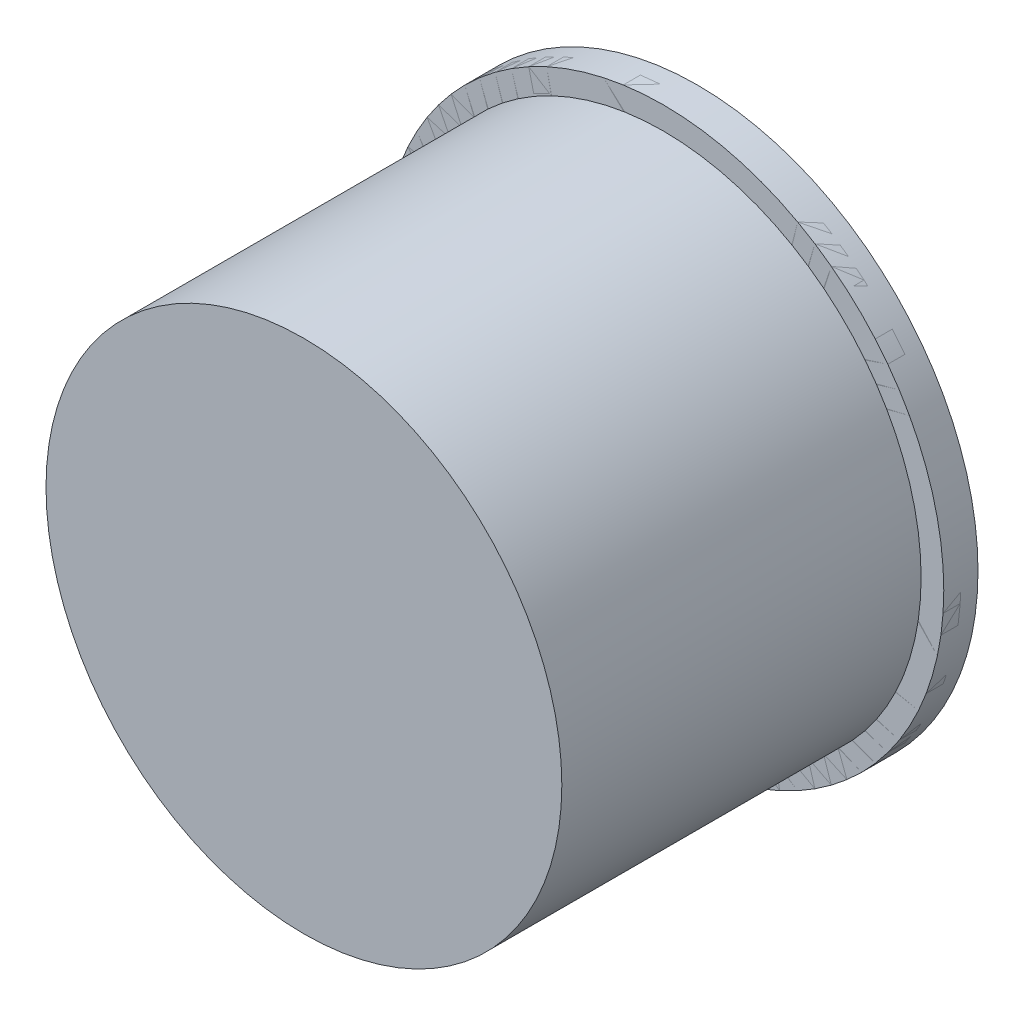
ISO-10303-21;
HEADER;
FILE_DESCRIPTION(('STEP AP214'),'2;1');
FILE_NAME('part.step','',(''),(''),'','','');
FILE_SCHEMA(('AUTOMOTIVE_DESIGN { 1 0 10303 214 1 1 1 1 }'));
ENDSEC;
DATA;
#1=APPLICATION_CONTEXT('core data for automotive mechanical design processes');
#2=APPLICATION_PROTOCOL_DEFINITION('international standard','automotive_design',2000,#1);
#3=PRODUCT_CONTEXT('',#1,'mechanical');
#4=PRODUCT('Part','Part','',(#3));
#5=PRODUCT_RELATED_PRODUCT_CATEGORY('part','',(#4));
#6=PRODUCT_DEFINITION_FORMATION('','',#4);
#7=PRODUCT_DEFINITION_CONTEXT('part definition',#1,'design');
#8=PRODUCT_DEFINITION('design','',#6,#7);
#9=PRODUCT_DEFINITION_SHAPE('','',#8);
#10=(LENGTH_UNIT() NAMED_UNIT(*) SI_UNIT(.MILLI.,.METRE.));
#11=(NAMED_UNIT(*) PLANE_ANGLE_UNIT() SI_UNIT($,.RADIAN.));
#12=(NAMED_UNIT(*) SI_UNIT($,.STERADIAN.) SOLID_ANGLE_UNIT());
#13=UNCERTAINTY_MEASURE_WITH_UNIT(LENGTH_MEASURE(1.E-05),#10,'distance_accuracy_value','');
#14=(GEOMETRIC_REPRESENTATION_CONTEXT(3) GLOBAL_UNCERTAINTY_ASSIGNED_CONTEXT((#13)) GLOBAL_UNIT_ASSIGNED_CONTEXT((#10,
#11,#12)) REPRESENTATION_CONTEXT('',''));
#15=CARTESIAN_POINT('',(0.,0.,0.));
#16=DIRECTION('',(0.,0.,1.));
#17=DIRECTION('',(1.,0.,0.));
#18=AXIS2_PLACEMENT_3D('',#15,#16,#17);
#19=CARTESIAN_POINT('',(0.,0.,-8.5));
#20=DIRECTION('',(0.,0.,1.));
#21=DIRECTION('',(1.,0.,0.));
#22=AXIS2_PLACEMENT_3D('',#19,#20,#21);
#23=CYLINDRICAL_SURFACE('',#22,16.4);
#24=CARTESIAN_POINT('',(0.,0.,-6.5));
#25=DIRECTION('',(0.,0.,-1.));
#26=DIRECTION('',(1.,0.,0.));
#27=AXIS2_PLACEMENT_3D('',#24,#25,#26);
#28=CIRCLE('',#27,16.4);
#29=CARTESIAN_POINT('',(16.4,0.,-6.5));
#30=VERTEX_POINT('',#29);
#31=EDGE_CURVE('P0_E63',#30,#30,#28,.T.);
#32=ORIENTED_EDGE('',*,*,#31,.T.);
#33=EDGE_LOOP('',(#32));
#34=FACE_BOUND('',#33,.T.);
#35=CARTESIAN_POINT('',(0.,0.,-7.5));
#36=DIRECTION('',(0.,0.,-1.));
#37=DIRECTION('',(-1.,0.,0.));
#38=AXIS2_PLACEMENT_3D('',#35,#36,#37);
#39=CIRCLE('',#38,16.4);
#40=CARTESIAN_POINT('',(-16.4,0.,-7.5));
#41=VERTEX_POINT('',#40);
#42=EDGE_CURVE('P0_E67',#41,#41,#39,.T.);
#43=ORIENTED_EDGE('',*,*,#42,.F.);
#44=EDGE_LOOP('',(#43));
#45=FACE_BOUND('',#44,.T.);
#46=ADVANCED_FACE('P0_F47',(#34,#45),#23,.T.);
#47=CARTESIAN_POINT('',(0.,0.,-6.5));
#48=DIRECTION('',(0.,0.,-1.));
#49=DIRECTION('',(0.,-1.,0.));
#50=AXIS2_PLACEMENT_3D('',#47,#48,#49);
#51=PLANE('',#50);
#52=CARTESIAN_POINT('',(0.,0.,-6.5));
#53=DIRECTION('',(0.,0.,-1.));
#54=DIRECTION('',(-1.,0.,0.));
#55=AXIS2_PLACEMENT_3D('',#52,#53,#54);
#56=CIRCLE('',#55,15.075);
#57=CARTESIAN_POINT('',(-15.075,0.,-6.5));
#58=VERTEX_POINT('',#57);
#59=EDGE_CURVE('P0_E11',#58,#58,#56,.F.);
#60=ORIENTED_EDGE('',*,*,#59,.F.);
#61=EDGE_LOOP('',(#60));
#62=FACE_BOUND('',#61,.T.);
#63=ORIENTED_EDGE('',*,*,#31,.F.);
#64=EDGE_LOOP('',(#63));
#65=FACE_BOUND('',#64,.T.);
#66=ADVANCED_FACE('P0_F49',(#62,#65),#51,.F.);
#67=CARTESIAN_POINT('',(0.,0.,-7.5));
#68=DIRECTION('',(0.,0.,-1.));
#69=DIRECTION('',(-1.,0.,0.));
#70=AXIS2_PLACEMENT_3D('',#67,#68,#69);
#71=PLANE('',#70);
#72=CARTESIAN_POINT('',(0.,0.,-7.5));
#73=DIRECTION('',(0.,0.,-1.));
#74=DIRECTION('',(-1.,0.,0.));
#75=AXIS2_PLACEMENT_3D('',#72,#73,#74);
#76=CIRCLE('',#75,2.55);
#77=CARTESIAN_POINT('',(-2.55,0.,-7.5));
#78=VERTEX_POINT('',#77);
#79=EDGE_CURVE('P0_E55',#78,#78,#76,.T.);
#80=ORIENTED_EDGE('',*,*,#79,.F.);
#81=EDGE_LOOP('',(#80));
#82=FACE_BOUND('',#81,.T.);
#83=ORIENTED_EDGE('',*,*,#42,.T.);
#84=EDGE_LOOP('',(#83));
#85=FACE_BOUND('',#84,.T.);
#86=ADVANCED_FACE('P0_F104',(#82,#85),#71,.T.);
#87=CARTESIAN_POINT('',(0.,0.,-11.5));
#88=DIRECTION('',(0.,0.,1.));
#89=DIRECTION('',(1.,0.,0.));
#90=AXIS2_PLACEMENT_3D('',#87,#88,#89);
#91=CYLINDRICAL_SURFACE('',#90,2.55);
#92=CARTESIAN_POINT('',(0.,0.,-11.5));
#93=DIRECTION('',(0.,0.,-1.));
#94=DIRECTION('',(-1.,0.,0.));
#95=AXIS2_PLACEMENT_3D('',#92,#93,#94);
#96=CIRCLE('',#95,2.55);
#97=CARTESIAN_POINT('',(-2.55,0.,-11.5));
#98=VERTEX_POINT('',#97);
#99=EDGE_CURVE('P0_E74',#98,#98,#96,.T.);
#100=ORIENTED_EDGE('',*,*,#99,.F.);
#101=EDGE_LOOP('',(#100));
#102=FACE_BOUND('',#101,.T.);
#103=ORIENTED_EDGE('',*,*,#79,.T.);
#104=EDGE_LOOP('',(#103));
#105=FACE_BOUND('',#104,.T.);
#106=ADVANCED_FACE('P0_F97',(#102,#105),#91,.T.);
#107=CARTESIAN_POINT('',(0.,0.,-11.5));
#108=DIRECTION('',(0.,0.,-1.));
#109=DIRECTION('',(-1.,0.,0.));
#110=AXIS2_PLACEMENT_3D('',#107,#108,#109);
#111=PLANE('',#110);
#112=ORIENTED_EDGE('',*,*,#99,.T.);
#113=EDGE_LOOP('',(#112));
#114=FACE_BOUND('',#113,.T.);
#115=ADVANCED_FACE('P0_F89',(#114),#111,.T.);
#116=CARTESIAN_POINT('',(0.,0.,57.1385389055488));
#117=DIRECTION('',(0.,0.,-1.));
#118=DIRECTION('',(-1.,0.,0.));
#119=AXIS2_PLACEMENT_3D('',#116,#117,#118);
#120=CYLINDRICAL_SURFACE('',#119,15.075);
#121=ORIENTED_EDGE('',*,*,#59,.T.);
#122=EDGE_LOOP('',(#121));
#123=FACE_BOUND('',#122,.T.);
#124=CARTESIAN_POINT('',(0.,0.,14.5));
#125=DIRECTION('',(0.,0.,1.));
#126=DIRECTION('',(1.,0.,0.));
#127=AXIS2_PLACEMENT_3D('',#124,#125,#126);
#128=CIRCLE('',#127,15.075);
#129=CARTESIAN_POINT('',(15.075,0.,14.5));
#130=VERTEX_POINT('',#129);
#131=EDGE_CURVE('P0_E80',#130,#130,#128,.T.);
#132=ORIENTED_EDGE('',*,*,#131,.F.);
#133=EDGE_LOOP('',(#132));
#134=FACE_BOUND('',#133,.T.);
#135=ADVANCED_FACE('P0_F87',(#123,#134),#120,.T.);
#136=CARTESIAN_POINT('',(0.,0.,14.5));
#137=DIRECTION('',(0.,0.,1.));
#138=DIRECTION('',(1.,0.,0.));
#139=AXIS2_PLACEMENT_3D('',#136,#137,#138);
#140=PLANE('',#139);
#141=ORIENTED_EDGE('',*,*,#131,.T.);
#142=EDGE_LOOP('',(#141));
#143=FACE_BOUND('',#142,.T.);
#144=ADVANCED_FACE('P0_F85',(#143),#140,.T.);
#145=CLOSED_SHELL('',(#46,#66,#86,#106,#115,#135,#144));
#146=MANIFOLD_SOLID_BREP('P0_B2',#145);
#147=CARTESIAN_POINT('',(0.,13.5,8.5));
#148=DIRECTION('',(0.,0.,1.));
#149=DIRECTION('',(1.,0.,0.));
#150=AXIS2_PLACEMENT_3D('',#147,#148,#149);
#151=CONICAL_SURFACE('',#150,1.25,0.785398162500002);
#152=CARTESIAN_POINT('',(0.,13.5,8.5));
#153=DIRECTION('',(0.,0.,-1.));
#154=DIRECTION('',(1.,0.,0.));
#155=AXIS2_PLACEMENT_3D('',#152,#153,#154);
#156=CIRCLE('',#155,1.25);
#157=CARTESIAN_POINT('',(1.25000000000005,13.5,8.5));
#158=VERTEX_POINT('',#157);
#159=EDGE_CURVE('P1_E19',#158,#158,#156,.T.);
#160=ORIENTED_EDGE('',*,*,#159,.F.);
#161=EDGE_LOOP('',(#160));
#162=FACE_BOUND('',#161,.T.);
#163=CARTESIAN_POINT('',(0.,13.5,8.275));
#164=DIRECTION('',(0.,0.,1.));
#165=DIRECTION('',(1.,0.,0.));
#166=AXIS2_PLACEMENT_3D('',#163,#164,#165);
#167=CIRCLE('',#166,1.025);
#168=CARTESIAN_POINT('',(1.02500000000005,13.5,8.275));
#169=VERTEX_POINT('',#168);
#170=EDGE_CURVE('P1_E10',#169,#169,#167,.T.);
#171=ORIENTED_EDGE('',*,*,#170,.F.);
#172=EDGE_LOOP('',(#171));
#173=FACE_BOUND('',#172,.T.);
#174=ADVANCED_FACE('P1_F15',(#162,#173),#151,.F.);
#175=CARTESIAN_POINT('',(0.,13.5,8.5));
#176=DIRECTION('',(0.,0.,-1.));
#177=DIRECTION('',(-1.,0.,0.));
#178=AXIS2_PLACEMENT_3D('',#175,#176,#177);
#179=CYLINDRICAL_SURFACE('',#178,1.025);
#180=CARTESIAN_POINT('',(0.,13.5,3.5));
#181=DIRECTION('',(0.,0.,1.));
#182=DIRECTION('',(-1.,0.,0.));
#183=AXIS2_PLACEMENT_3D('',#180,#181,#182);
#184=CIRCLE('',#183,1.025);
#185=CARTESIAN_POINT('',(-1.02499999999995,13.5,3.5));
#186=VERTEX_POINT('',#185);
#187=EDGE_CURVE('P1_E26',#186,#186,#184,.T.);
#188=ORIENTED_EDGE('',*,*,#187,.F.);
#189=EDGE_LOOP('',(#188));
#190=FACE_BOUND('',#189,.T.);
#191=ORIENTED_EDGE('',*,*,#170,.T.);
#192=EDGE_LOOP('',(#191));
#193=FACE_BOUND('',#192,.T.);
#194=ADVANCED_FACE('P1_F211',(#190,#193),#179,.F.);
#195=CARTESIAN_POINT('',(0.,13.5,3.5));
#196=DIRECTION('',(0.,0.,1.));
#197=DIRECTION('',(1.,0.,0.));
#198=AXIS2_PLACEMENT_3D('',#195,#196,#197);
#199=CONICAL_SURFACE('',#198,1.025,1.0297442575);
#200=CARTESIAN_POINT('',(0.,13.5,2.88411786549675));
#201=VERTEX_POINT('',#200);
#202=VERTEX_LOOP('',#201);
#203=FACE_BOUND('',#202,.T.);
#204=ORIENTED_EDGE('',*,*,#187,.T.);
#205=EDGE_LOOP('',(#204));
#206=FACE_BOUND('',#205,.T.);
#207=ADVANCED_FACE('P1_F217',(#203,#206),#199,.F.);
#208=CARTESIAN_POINT('',(13.5,0.,8.5));
#209=DIRECTION('',(0.,0.,1.));
#210=DIRECTION('',(1.,0.,0.));
#211=AXIS2_PLACEMENT_3D('',#208,#209,#210);
#212=CONICAL_SURFACE('',#211,1.25,0.7853981625);
#213=CARTESIAN_POINT('',(13.5,0.,8.5));
#214=DIRECTION('',(0.,0.,-1.));
#215=DIRECTION('',(1.,0.,0.));
#216=AXIS2_PLACEMENT_3D('',#213,#214,#215);
#217=CIRCLE('',#216,1.25);
#218=CARTESIAN_POINT('',(14.75,0.,8.5));
#219=VERTEX_POINT('',#218);
#220=EDGE_CURVE('P1_E166',#219,#219,#217,.T.);
#221=ORIENTED_EDGE('',*,*,#220,.F.);
#222=EDGE_LOOP('',(#221));
#223=FACE_BOUND('',#222,.T.);
#224=CARTESIAN_POINT('',(13.5,0.,8.275));
#225=DIRECTION('',(0.,0.,1.));
#226=DIRECTION('',(1.,0.,0.));
#227=AXIS2_PLACEMENT_3D('',#224,#225,#226);
#228=CIRCLE('',#227,1.025);
#229=CARTESIAN_POINT('',(14.525,0.,8.275));
#230=VERTEX_POINT('',#229);
#231=EDGE_CURVE('P1_E120',#230,#230,#228,.T.);
#232=ORIENTED_EDGE('',*,*,#231,.F.);
#233=EDGE_LOOP('',(#232));
#234=FACE_BOUND('',#233,.T.);
#235=ADVANCED_FACE('P1_F222',(#223,#234),#212,.F.);
#236=CARTESIAN_POINT('',(13.5,0.,8.5));
#237=DIRECTION('',(0.,0.,-1.));
#238=DIRECTION('',(-1.,0.,0.));
#239=AXIS2_PLACEMENT_3D('',#236,#237,#238);
#240=CYLINDRICAL_SURFACE('',#239,1.025);
#241=CARTESIAN_POINT('',(13.5,0.,3.5));
#242=DIRECTION('',(0.,0.,1.));
#243=DIRECTION('',(-1.,0.,0.));
#244=AXIS2_PLACEMENT_3D('',#241,#242,#243);
#245=CIRCLE('',#244,1.025);
#246=CARTESIAN_POINT('',(12.475,0.,3.5));
#247=VERTEX_POINT('',#246);
#248=EDGE_CURVE('P1_E124',#247,#247,#245,.T.);
#249=ORIENTED_EDGE('',*,*,#248,.F.);
#250=EDGE_LOOP('',(#249));
#251=FACE_BOUND('',#250,.T.);
#252=ORIENTED_EDGE('',*,*,#231,.T.);
#253=EDGE_LOOP('',(#252));
#254=FACE_BOUND('',#253,.T.);
#255=ADVANCED_FACE('P1_F121',(#251,#254),#240,.F.);
#256=CARTESIAN_POINT('',(13.5,0.,3.5));
#257=DIRECTION('',(0.,0.,1.));
#258=DIRECTION('',(1.,0.,0.));
#259=AXIS2_PLACEMENT_3D('',#256,#257,#258);
#260=CONICAL_SURFACE('',#259,1.025,1.0297442575);
#261=CARTESIAN_POINT('',(13.5,0.,2.88411786549675));
#262=VERTEX_POINT('',#261);
#263=VERTEX_LOOP('',#262);
#264=FACE_BOUND('',#263,.T.);
#265=ORIENTED_EDGE('',*,*,#248,.T.);
#266=EDGE_LOOP('',(#265));
#267=FACE_BOUND('',#266,.T.);
#268=ADVANCED_FACE('P1_F17',(#264,#267),#260,.F.);
#269=CARTESIAN_POINT('',(0.,-13.5,8.5));
#270=DIRECTION('',(0.,0.,1.));
#271=DIRECTION('',(1.,0.,0.));
#272=AXIS2_PLACEMENT_3D('',#269,#270,#271);
#273=CONICAL_SURFACE('',#272,1.25,0.785398162500002);
#274=CARTESIAN_POINT('',(0.,-13.5,8.5));
#275=DIRECTION('',(0.,0.,-1.));
#276=DIRECTION('',(1.,0.,0.));
#277=AXIS2_PLACEMENT_3D('',#274,#275,#276);
#278=CIRCLE('',#277,1.25);
#279=CARTESIAN_POINT('',(1.24999999999998,-13.5,8.5));
#280=VERTEX_POINT('',#279);
#281=EDGE_CURVE('P1_E164',#280,#280,#278,.T.);
#282=ORIENTED_EDGE('',*,*,#281,.F.);
#283=EDGE_LOOP('',(#282));
#284=FACE_BOUND('',#283,.T.);
#285=CARTESIAN_POINT('',(0.,-13.5,8.275));
#286=DIRECTION('',(0.,0.,1.));
#287=DIRECTION('',(1.,0.,0.));
#288=AXIS2_PLACEMENT_3D('',#285,#286,#287);
#289=CIRCLE('',#288,1.025);
#290=CARTESIAN_POINT('',(1.02499999999998,-13.5,8.275));
#291=VERTEX_POINT('',#290);
#292=EDGE_CURVE('P1_E132',#291,#291,#289,.T.);
#293=ORIENTED_EDGE('',*,*,#292,.F.);
#294=EDGE_LOOP('',(#293));
#295=FACE_BOUND('',#294,.T.);
#296=ADVANCED_FACE('P1_F240',(#284,#295),#273,.F.);
#297=CARTESIAN_POINT('',(0.,-13.5,8.5));
#298=DIRECTION('',(0.,0.,-1.));
#299=DIRECTION('',(-1.,0.,0.));
#300=AXIS2_PLACEMENT_3D('',#297,#298,#299);
#301=CYLINDRICAL_SURFACE('',#300,1.025);
#302=CARTESIAN_POINT('',(0.,-13.5,3.5));
#303=DIRECTION('',(0.,0.,1.));
#304=DIRECTION('',(-1.,0.,0.));
#305=AXIS2_PLACEMENT_3D('',#302,#303,#304);
#306=CIRCLE('',#305,1.025);
#307=CARTESIAN_POINT('',(-1.02500000000002,-13.5,3.5));
#308=VERTEX_POINT('',#307);
#309=EDGE_CURVE('P1_E160',#308,#308,#306,.T.);
#310=ORIENTED_EDGE('',*,*,#309,.F.);
#311=EDGE_LOOP('',(#310));
#312=FACE_BOUND('',#311,.T.);
#313=ORIENTED_EDGE('',*,*,#292,.T.);
#314=EDGE_LOOP('',(#313));
#315=FACE_BOUND('',#314,.T.);
#316=ADVANCED_FACE('P1_F236',(#312,#315),#301,.F.);
#317=CARTESIAN_POINT('',(0.,-13.5,3.5));
#318=DIRECTION('',(0.,0.,1.));
#319=DIRECTION('',(1.,0.,0.));
#320=AXIS2_PLACEMENT_3D('',#317,#318,#319);
#321=CONICAL_SURFACE('',#320,1.025,1.0297442575);
#322=CARTESIAN_POINT('',(0.,-13.5,2.88411786549675));
#323=VERTEX_POINT('',#322);
#324=VERTEX_LOOP('',#323);
#325=FACE_BOUND('',#324,.T.);
#326=ORIENTED_EDGE('',*,*,#309,.T.);
#327=EDGE_LOOP('',(#326));
#328=FACE_BOUND('',#327,.T.);
#329=ADVANCED_FACE('P1_F239',(#325,#328),#321,.F.);
#330=CARTESIAN_POINT('',(-13.5,0.,8.5));
#331=DIRECTION('',(0.,0.,1.));
#332=DIRECTION('',(1.,0.,0.));
#333=AXIS2_PLACEMENT_3D('',#330,#331,#332);
#334=CONICAL_SURFACE('',#333,1.25,0.7853981625);
#335=CARTESIAN_POINT('',(-13.5,0.,8.5));
#336=DIRECTION('',(0.,0.,-1.));
#337=DIRECTION('',(1.,0.,0.));
#338=AXIS2_PLACEMENT_3D('',#335,#336,#337);
#339=CIRCLE('',#338,1.25);
#340=CARTESIAN_POINT('',(-12.25,0.,8.5));
#341=VERTEX_POINT('',#340);
#342=EDGE_CURVE('P1_E156',#341,#341,#339,.T.);
#343=ORIENTED_EDGE('',*,*,#342,.F.);
#344=EDGE_LOOP('',(#343));
#345=FACE_BOUND('',#344,.T.);
#346=CARTESIAN_POINT('',(-13.5,0.,8.275));
#347=DIRECTION('',(0.,0.,1.));
#348=DIRECTION('',(1.,0.,0.));
#349=AXIS2_PLACEMENT_3D('',#346,#347,#348);
#350=CIRCLE('',#349,1.025);
#351=CARTESIAN_POINT('',(-12.475,0.,8.275));
#352=VERTEX_POINT('',#351);
#353=EDGE_CURVE('P1_E161',#352,#352,#350,.T.);
#354=ORIENTED_EDGE('',*,*,#353,.F.);
#355=EDGE_LOOP('',(#354));
#356=FACE_BOUND('',#355,.T.);
#357=ADVANCED_FACE('P1_F321',(#345,#356),#334,.F.);
#358=CARTESIAN_POINT('',(-13.5,0.,8.5));
#359=DIRECTION('',(0.,0.,-1.));
#360=DIRECTION('',(-1.,0.,0.));
#361=AXIS2_PLACEMENT_3D('',#358,#359,#360);
#362=CYLINDRICAL_SURFACE('',#361,1.025);
#363=CARTESIAN_POINT('',(-13.5,0.,3.5));
#364=DIRECTION('',(0.,0.,1.));
#365=DIRECTION('',(-1.,0.,0.));
#366=AXIS2_PLACEMENT_3D('',#363,#364,#365);
#367=CIRCLE('',#366,1.025);
#368=CARTESIAN_POINT('',(-14.525,0.,3.5));
#369=VERTEX_POINT('',#368);
#370=EDGE_CURVE('P1_E163',#369,#369,#367,.T.);
#371=ORIENTED_EDGE('',*,*,#370,.F.);
#372=EDGE_LOOP('',(#371));
#373=FACE_BOUND('',#372,.T.);
#374=ORIENTED_EDGE('',*,*,#353,.T.);
#375=EDGE_LOOP('',(#374));
#376=FACE_BOUND('',#375,.T.);
#377=ADVANCED_FACE('P1_F329',(#373,#376),#362,.F.);
#378=CARTESIAN_POINT('',(-13.5,0.,3.5));
#379=DIRECTION('',(0.,0.,1.));
#380=DIRECTION('',(1.,0.,0.));
#381=AXIS2_PLACEMENT_3D('',#378,#379,#380);
#382=CONICAL_SURFACE('',#381,1.025,1.0297442575);
#383=CARTESIAN_POINT('',(-13.5,0.,2.88411786549675));
#384=VERTEX_POINT('',#383);
#385=VERTEX_LOOP('',#384);
#386=FACE_BOUND('',#385,.T.);
#387=ORIENTED_EDGE('',*,*,#370,.T.);
#388=EDGE_LOOP('',(#387));
#389=FACE_BOUND('',#388,.T.);
#390=ADVANCED_FACE('P1_F261',(#386,#389),#382,.F.);
#391=CARTESIAN_POINT('',(0.,0.,-2.5));
#392=DIRECTION('',(0.,0.,-1.));
#393=DIRECTION('',(-1.,0.,0.));
#394=AXIS2_PLACEMENT_3D('',#391,#392,#393);
#395=CYLINDRICAL_SURFACE('',#394,12.);
#396=CARTESIAN_POINT('',(0.,0.,-8.5));
#397=DIRECTION('',(0.,0.,-1.));
#398=DIRECTION('',(1.,0.,0.));
#399=AXIS2_PLACEMENT_3D('',#396,#397,#398);
#400=CIRCLE('',#399,12.);
#401=CARTESIAN_POINT('',(12.,0.,-8.5));
#402=VERTEX_POINT('',#401);
#403=EDGE_CURVE('P1_E138',#402,#402,#400,.T.);
#404=ORIENTED_EDGE('',*,*,#403,.T.);
#405=EDGE_LOOP('',(#404));
#406=FACE_BOUND('',#405,.T.);
#407=CARTESIAN_POINT('',(0.,0.,-2.5));
#408=DIRECTION('',(0.,0.,1.));
#409=DIRECTION('',(1.,0.,0.));
#410=AXIS2_PLACEMENT_3D('',#407,#408,#409);
#411=CIRCLE('',#410,12.);
#412=CARTESIAN_POINT('',(12.,0.,-2.5));
#413=VERTEX_POINT('',#412);
#414=EDGE_CURVE('P1_E264',#413,#413,#411,.T.);
#415=ORIENTED_EDGE('',*,*,#414,.T.);
#416=EDGE_LOOP('',(#415));
#417=FACE_BOUND('',#416,.T.);
#418=ADVANCED_FACE('P1_F258',(#406,#417),#395,.F.);
#419=CARTESIAN_POINT('',(0.,0.,-2.5));
#420=DIRECTION('',(0.,0.,-1.));
#421=DIRECTION('',(0.,-1.,0.));
#422=AXIS2_PLACEMENT_3D('',#419,#420,#421);
#423=PLANE('',#422);
#424=CARTESIAN_POINT('',(0.,0.,-2.5));
#425=DIRECTION('',(0.,0.,1.));
#426=DIRECTION('',(-1.,0.,0.));
#427=AXIS2_PLACEMENT_3D('',#424,#425,#426);
#428=CIRCLE('',#427,11.);
#429=CARTESIAN_POINT('',(-11.,0.,-2.5));
#430=VERTEX_POINT('',#429);
#431=EDGE_CURVE('P1_E176',#430,#430,#428,.T.);
#432=ORIENTED_EDGE('',*,*,#431,.T.);
#433=EDGE_LOOP('',(#432));
#434=FACE_BOUND('',#433,.T.);
#435=ORIENTED_EDGE('',*,*,#414,.F.);
#436=EDGE_LOOP('',(#435));
#437=FACE_BOUND('',#436,.T.);
#438=ADVANCED_FACE('P1_F231',(#434,#437),#423,.T.);
#439=CARTESIAN_POINT('',(0.,0.,2.5));
#440=DIRECTION('',(0.,0.,1.));
#441=DIRECTION('',(1.,0.,0.));
#442=AXIS2_PLACEMENT_3D('',#439,#440,#441);
#443=CYLINDRICAL_SURFACE('',#442,12.);
#444=CARTESIAN_POINT('',(0.,0.,8.5));
#445=DIRECTION('',(0.,0.,1.));
#446=DIRECTION('',(1.,0.,0.));
#447=AXIS2_PLACEMENT_3D('',#444,#445,#446);
#448=CIRCLE('',#447,12.);
#449=CARTESIAN_POINT('',(12.,0.,8.5));
#450=VERTEX_POINT('',#449);
#451=EDGE_CURVE('P1_E148',#450,#450,#448,.T.);
#452=ORIENTED_EDGE('',*,*,#451,.T.);
#453=EDGE_LOOP('',(#452));
#454=FACE_BOUND('',#453,.T.);
#455=CARTESIAN_POINT('',(0.,0.,2.5));
#456=DIRECTION('',(0.,0.,-1.));
#457=DIRECTION('',(1.,0.,0.));
#458=AXIS2_PLACEMENT_3D('',#455,#456,#457);
#459=CIRCLE('',#458,12.);
#460=CARTESIAN_POINT('',(12.,0.,2.5));
#461=VERTEX_POINT('',#460);
#462=EDGE_CURVE('P1_E145',#461,#461,#459,.T.);
#463=ORIENTED_EDGE('',*,*,#462,.T.);
#464=EDGE_LOOP('',(#463));
#465=FACE_BOUND('',#464,.T.);
#466=ADVANCED_FACE('P1_F228',(#454,#465),#443,.F.);
#467=CARTESIAN_POINT('',(0.,0.,2.5));
#468=DIRECTION('',(0.,0.,1.));
#469=DIRECTION('',(1.,0.,0.));
#470=AXIS2_PLACEMENT_3D('',#467,#468,#469);
#471=PLANE('',#470);
#472=CARTESIAN_POINT('',(0.,0.,2.5));
#473=DIRECTION('',(0.,0.,-1.));
#474=DIRECTION('',(1.,0.,0.));
#475=AXIS2_PLACEMENT_3D('',#472,#473,#474);
#476=CIRCLE('',#475,11.);
#477=CARTESIAN_POINT('',(11.,0.,2.5));
#478=VERTEX_POINT('',#477);
#479=EDGE_CURVE('P1_E182',#478,#478,#476,.T.);
#480=ORIENTED_EDGE('',*,*,#479,.T.);
#481=EDGE_LOOP('',(#480));
#482=FACE_BOUND('',#481,.T.);
#483=ORIENTED_EDGE('',*,*,#462,.F.);
#484=EDGE_LOOP('',(#483));
#485=FACE_BOUND('',#484,.T.);
#486=ADVANCED_FACE('P1_F192',(#482,#485),#471,.T.);
#487=CARTESIAN_POINT('',(0.,0.,-6.5));
#488=DIRECTION('',(0.,0.,-1.));
#489=DIRECTION('',(0.,-1.,0.));
#490=AXIS2_PLACEMENT_3D('',#487,#488,#489);
#491=PLANE('',#490);
#492=CARTESIAN_POINT('',(0.,0.,-6.5));
#493=DIRECTION('',(0.,0.,-1.));
#494=DIRECTION('',(1.,0.,0.));
#495=AXIS2_PLACEMENT_3D('',#492,#493,#494);
#496=CIRCLE('',#495,16.4);
#497=CARTESIAN_POINT('',(16.4,0.,-6.5));
#498=VERTEX_POINT('',#497);
#499=EDGE_CURVE('P1_E136',#498,#498,#496,.T.);
#500=ORIENTED_EDGE('',*,*,#499,.F.);
#501=EDGE_LOOP('',(#500));
#502=FACE_BOUND('',#501,.T.);
#503=CARTESIAN_POINT('',(0.,0.,-6.5));
#504=DIRECTION('',(0.,0.,1.));
#505=DIRECTION('',(1.,0.,0.));
#506=AXIS2_PLACEMENT_3D('',#503,#504,#505);
#507=CIRCLE('',#506,15.);
#508=CARTESIAN_POINT('',(15.,0.,-6.5));
#509=VERTEX_POINT('',#508);
#510=EDGE_CURVE('P1_E170',#509,#509,#507,.T.);
#511=ORIENTED_EDGE('',*,*,#510,.F.);
#512=EDGE_LOOP('',(#511));
#513=FACE_BOUND('',#512,.T.);
#514=ADVANCED_FACE('P1_F244',(#502,#513),#491,.F.);
#515=CARTESIAN_POINT('',(0.,0.,-8.5));
#516=DIRECTION('',(0.,0.,-1.));
#517=DIRECTION('',(0.,-1.,0.));
#518=AXIS2_PLACEMENT_3D('',#515,#516,#517);
#519=PLANE('',#518);
#520=CARTESIAN_POINT('',(0.,0.,-8.5));
#521=DIRECTION('',(0.,0.,-1.));
#522=DIRECTION('',(1.,0.,0.));
#523=AXIS2_PLACEMENT_3D('',#520,#521,#522);
#524=CIRCLE('',#523,16.4);
#525=CARTESIAN_POINT('',(16.4,0.,-8.5));
#526=VERTEX_POINT('',#525);
#527=EDGE_CURVE('P1_E139',#526,#526,#524,.T.);
#528=ORIENTED_EDGE('',*,*,#527,.T.);
#529=EDGE_LOOP('',(#528));
#530=FACE_BOUND('',#529,.T.);
#531=ORIENTED_EDGE('',*,*,#403,.F.);
#532=EDGE_LOOP('',(#531));
#533=FACE_BOUND('',#532,.T.);
#534=ADVANCED_FACE('P1_F245',(#530,#533),#519,.T.);
#535=CARTESIAN_POINT('',(0.,0.,-8.5));
#536=DIRECTION('',(0.,0.,1.));
#537=DIRECTION('',(1.,0.,0.));
#538=AXIS2_PLACEMENT_3D('',#535,#536,#537);
#539=CYLINDRICAL_SURFACE('',#538,16.4);
#540=ORIENTED_EDGE('',*,*,#499,.T.);
#541=EDGE_LOOP('',(#540));
#542=FACE_BOUND('',#541,.T.);
#543=ORIENTED_EDGE('',*,*,#527,.F.);
#544=EDGE_LOOP('',(#543));
#545=FACE_BOUND('',#544,.T.);
#546=ADVANCED_FACE('P1_F247',(#542,#545),#539,.T.);
#547=CARTESIAN_POINT('',(0.,0.,8.5));
#548=DIRECTION('',(0.,0.,1.));
#549=DIRECTION('',(1.,0.,0.));
#550=AXIS2_PLACEMENT_3D('',#547,#548,#549);
#551=PLANE('',#550);
#552=CARTESIAN_POINT('',(0.,0.,8.5));
#553=DIRECTION('',(0.,0.,1.));
#554=DIRECTION('',(1.,0.,0.));
#555=AXIS2_PLACEMENT_3D('',#552,#553,#554);
#556=CIRCLE('',#555,15.);
#557=CARTESIAN_POINT('',(15.,0.,8.5));
#558=VERTEX_POINT('',#557);
#559=EDGE_CURVE('P1_E167',#558,#558,#556,.T.);
#560=ORIENTED_EDGE('',*,*,#559,.T.);
#561=EDGE_LOOP('',(#560));
#562=FACE_BOUND('',#561,.T.);
#563=ORIENTED_EDGE('',*,*,#451,.F.);
#564=EDGE_LOOP('',(#563));
#565=FACE_BOUND('',#564,.T.);
#566=ORIENTED_EDGE('',*,*,#342,.T.);
#567=EDGE_LOOP('',(#566));
#568=FACE_BOUND('',#567,.T.);
#569=ORIENTED_EDGE('',*,*,#281,.T.);
#570=EDGE_LOOP('',(#569));
#571=FACE_BOUND('',#570,.T.);
#572=ORIENTED_EDGE('',*,*,#220,.T.);
#573=EDGE_LOOP('',(#572));
#574=FACE_BOUND('',#573,.T.);
#575=ORIENTED_EDGE('',*,*,#159,.T.);
#576=EDGE_LOOP('',(#575));
#577=FACE_BOUND('',#576,.T.);
#578=ADVANCED_FACE('P1_F204',(#562,#565,#568,#571,#574,#577),#551,.T.);
#579=CARTESIAN_POINT('',(0.,0.,-6.5));
#580=DIRECTION('',(0.,0.,1.));
#581=DIRECTION('',(1.,0.,0.));
#582=AXIS2_PLACEMENT_3D('',#579,#580,#581);
#583=CYLINDRICAL_SURFACE('',#582,15.);
#584=ORIENTED_EDGE('',*,*,#559,.F.);
#585=EDGE_LOOP('',(#584));
#586=FACE_BOUND('',#585,.T.);
#587=ORIENTED_EDGE('',*,*,#510,.T.);
#588=EDGE_LOOP('',(#587));
#589=FACE_BOUND('',#588,.T.);
#590=ADVANCED_FACE('P1_F197',(#586,#589),#583,.T.);
#591=CARTESIAN_POINT('',(0.,0.,-6.5));
#592=DIRECTION('',(0.,0.,1.));
#593=DIRECTION('',(1.,0.,0.));
#594=AXIS2_PLACEMENT_3D('',#591,#592,#593);
#595=CYLINDRICAL_SURFACE('',#594,11.);
#596=ORIENTED_EDGE('',*,*,#431,.F.);
#597=EDGE_LOOP('',(#596));
#598=FACE_BOUND('',#597,.T.);
#599=ORIENTED_EDGE('',*,*,#479,.F.);
#600=EDGE_LOOP('',(#599));
#601=FACE_BOUND('',#600,.T.);
#602=ADVANCED_FACE('P1_F195',(#598,#601),#595,.F.);
#603=CLOSED_SHELL('',(#174,#194,#207,#235,#255,#268,#296,#316,#329,#357,#377,#390,#418,#438,
#466,#486,#514,#534,#546,#578,#590,#602));
#604=MANIFOLD_SOLID_BREP('P1_B1',#603);
#605=ADVANCED_BREP_SHAPE_REPRESENTATION('',(#18,#146,#604),#14);
#606=SHAPE_DEFINITION_REPRESENTATION(#9,#605);
ENDSEC;
END-ISO-10303-21;
